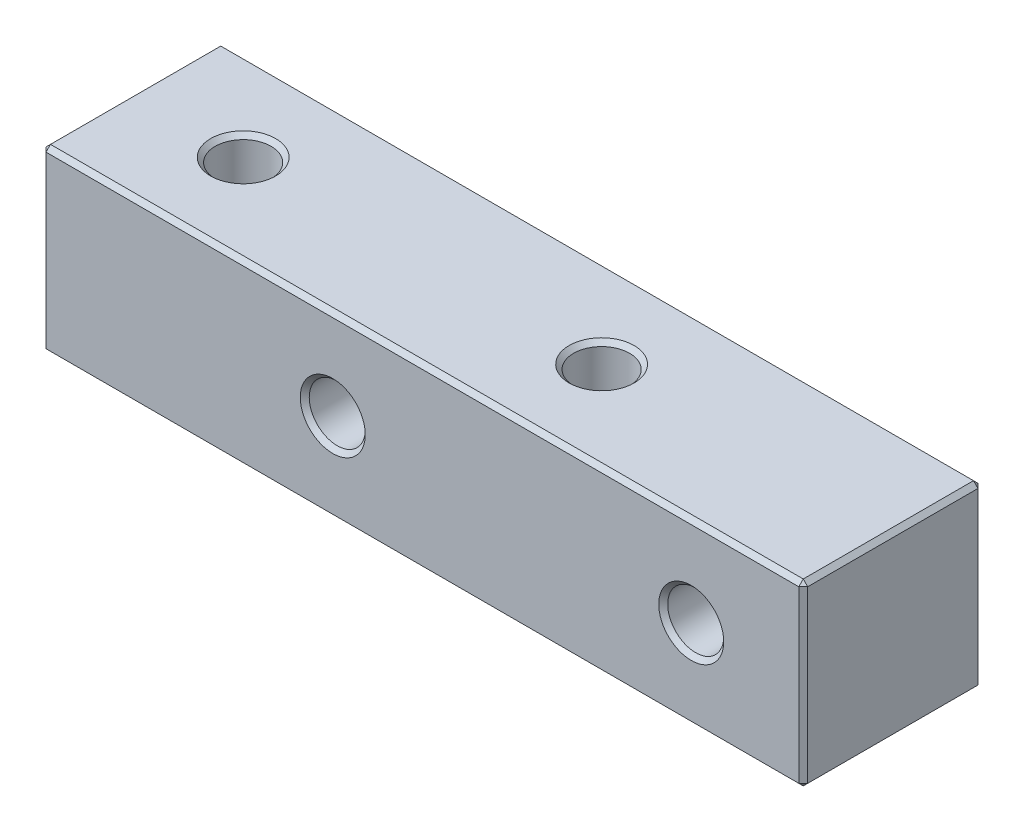
ISO-10303-21;
HEADER;
FILE_DESCRIPTION(('STEP AP214'),'2;1');
FILE_NAME('part.step','',(''),(''),'','','');
FILE_SCHEMA(('AUTOMOTIVE_DESIGN { 1 0 10303 214 1 1 1 1 }'));
ENDSEC;
DATA;
#1=APPLICATION_CONTEXT('core data for automotive mechanical design processes');
#2=APPLICATION_PROTOCOL_DEFINITION('international standard','automotive_design',2000,#1);
#3=PRODUCT_CONTEXT('',#1,'mechanical');
#4=PRODUCT('Part','Part','',(#3));
#5=PRODUCT_RELATED_PRODUCT_CATEGORY('part','',(#4));
#6=PRODUCT_DEFINITION_FORMATION('','',#4);
#7=PRODUCT_DEFINITION_CONTEXT('part definition',#1,'design');
#8=PRODUCT_DEFINITION('design','',#6,#7);
#9=PRODUCT_DEFINITION_SHAPE('','',#8);
#10=(LENGTH_UNIT() NAMED_UNIT(*) SI_UNIT(.MILLI.,.METRE.));
#11=(NAMED_UNIT(*) PLANE_ANGLE_UNIT() SI_UNIT($,.RADIAN.));
#12=(NAMED_UNIT(*) SI_UNIT($,.STERADIAN.) SOLID_ANGLE_UNIT());
#13=UNCERTAINTY_MEASURE_WITH_UNIT(LENGTH_MEASURE(1.E-05),#10,'distance_accuracy_value','');
#14=(GEOMETRIC_REPRESENTATION_CONTEXT(3) GLOBAL_UNCERTAINTY_ASSIGNED_CONTEXT((#13)) GLOBAL_UNIT_ASSIGNED_CONTEXT((#10,
#11,#12)) REPRESENTATION_CONTEXT('',''));
#15=CARTESIAN_POINT('',(0.,0.,0.));
#16=DIRECTION('',(0.,0.,1.));
#17=DIRECTION('',(1.,0.,0.));
#18=AXIS2_PLACEMENT_3D('',#15,#16,#17);
#19=CARTESIAN_POINT('',(17.,4.,-4.));
#20=DIRECTION('',(-1.,0.,0.));
#21=DIRECTION('',(0.,0.,1.));
#22=AXIS2_PLACEMENT_3D('',#19,#20,#21);
#23=PLANE('',#22);
#24=DIRECTION('',(0.,-1.,0.));
#25=VECTOR('',#24,1.);
#26=CARTESIAN_POINT('',(17.,4.,3.8));
#27=LINE('',#26,#25);
#28=CARTESIAN_POINT('',(17.,3.8,3.8));
#29=VERTEX_POINT('',#28);
#30=CARTESIAN_POINT('',(17.,-3.8,3.8));
#31=VERTEX_POINT('',#30);
#32=EDGE_CURVE('E241',#29,#31,#27,.T.);
#33=ORIENTED_EDGE('',*,*,#32,.T.);
#34=DIRECTION('',(0.,0.,-1.));
#35=VECTOR('',#34,1.);
#36=CARTESIAN_POINT('',(17.,-3.8,-4.));
#37=LINE('',#36,#35);
#38=CARTESIAN_POINT('',(17.,-3.8,-3.8));
#39=VERTEX_POINT('',#38);
#40=EDGE_CURVE('E243',#31,#39,#37,.T.);
#41=ORIENTED_EDGE('',*,*,#40,.T.);
#42=DIRECTION('',(0.,1.,0.));
#43=VECTOR('',#42,1.);
#44=CARTESIAN_POINT('',(17.,4.,-3.8));
#45=LINE('',#44,#43);
#46=CARTESIAN_POINT('',(17.,3.8,-3.8));
#47=VERTEX_POINT('',#46);
#48=EDGE_CURVE('E237',#39,#47,#45,.T.);
#49=ORIENTED_EDGE('',*,*,#48,.T.);
#50=DIRECTION('',(0.,0.,1.));
#51=VECTOR('',#50,1.);
#52=CARTESIAN_POINT('',(17.,3.8,4.));
#53=LINE('',#52,#51);
#54=EDGE_CURVE('E239',#47,#29,#53,.T.);
#55=ORIENTED_EDGE('',*,*,#54,.T.);
#56=EDGE_LOOP('',(#33,#41,#49,#55));
#57=FACE_BOUND('',#56,.T.);
#58=ADVANCED_FACE('F41',(#57),#23,.F.);
#59=CARTESIAN_POINT('',(-17.,4.,-4.));
#60=DIRECTION('',(0.,0.,1.));
#61=DIRECTION('',(1.,0.,0.));
#62=AXIS2_PLACEMENT_3D('',#59,#60,#61);
#63=PLANE('',#62);
#64=DIRECTION('',(1.,0.,0.));
#65=VECTOR('',#64,1.);
#66=CARTESIAN_POINT('',(17.,3.8,-4.));
#67=LINE('',#66,#65);
#68=CARTESIAN_POINT('',(-16.8,3.8,-4.));
#69=VERTEX_POINT('',#68);
#70=CARTESIAN_POINT('',(16.8,3.8,-4.));
#71=VERTEX_POINT('',#70);
#72=EDGE_CURVE('E51',#69,#71,#67,.T.);
#73=ORIENTED_EDGE('',*,*,#72,.T.);
#74=DIRECTION('',(0.,-1.,0.));
#75=VECTOR('',#74,1.);
#76=CARTESIAN_POINT('',(16.8,4.,-4.));
#77=LINE('',#76,#75);
#78=CARTESIAN_POINT('',(16.8,-3.8,-4.));
#79=VERTEX_POINT('',#78);
#80=EDGE_CURVE('E11',#71,#79,#77,.T.);
#81=ORIENTED_EDGE('',*,*,#80,.T.);
#82=DIRECTION('',(-1.,0.,0.));
#83=VECTOR('',#82,1.);
#84=CARTESIAN_POINT('',(-17.,-3.8,-4.));
#85=LINE('',#84,#83);
#86=CARTESIAN_POINT('',(-16.8,-3.8,-4.));
#87=VERTEX_POINT('',#86);
#88=EDGE_CURVE('E252',#79,#87,#85,.T.);
#89=ORIENTED_EDGE('',*,*,#88,.T.);
#90=DIRECTION('',(0.,1.,0.));
#91=VECTOR('',#90,1.);
#92=CARTESIAN_POINT('',(-16.8,4.,-4.));
#93=LINE('',#92,#91);
#94=EDGE_CURVE('E62',#87,#69,#93,.T.);
#95=ORIENTED_EDGE('',*,*,#94,.T.);
#96=EDGE_LOOP('',(#73,#81,#89,#95));
#97=FACE_BOUND('',#96,.T.);
#98=CARTESIAN_POINT('',(-4.,0.,-4.));
#99=DIRECTION('',(0.,0.,1.));
#100=DIRECTION('',(1.,0.,0.));
#101=AXIS2_PLACEMENT_3D('',#98,#99,#100);
#102=CIRCLE('',#101,1.44999999999998);
#103=CARTESIAN_POINT('',(-2.55000000000002,0.,-4.));
#104=VERTEX_POINT('',#103);
#105=EDGE_CURVE('E249',#104,#104,#102,.T.);
#106=ORIENTED_EDGE('',*,*,#105,.T.);
#107=EDGE_LOOP('',(#106));
#108=FACE_BOUND('',#107,.T.);
#109=CARTESIAN_POINT('',(12.,0.,-4.));
#110=DIRECTION('',(0.,0.,1.));
#111=DIRECTION('',(1.,0.,0.));
#112=AXIS2_PLACEMENT_3D('',#109,#110,#111);
#113=CIRCLE('',#112,1.44999999999998);
#114=CARTESIAN_POINT('',(13.45,0.,-4.));
#115=VERTEX_POINT('',#114);
#116=EDGE_CURVE('E246',#115,#115,#113,.T.);
#117=ORIENTED_EDGE('',*,*,#116,.T.);
#118=EDGE_LOOP('',(#117));
#119=FACE_BOUND('',#118,.T.);
#120=ADVANCED_FACE('F324',(#97,#108,#119),#63,.F.);
#121=CARTESIAN_POINT('',(-17.,4.,-4.));
#122=DIRECTION('',(1.,0.,0.));
#123=DIRECTION('',(0.,0.,-1.));
#124=AXIS2_PLACEMENT_3D('',#121,#122,#123);
#125=PLANE('',#124);
#126=DIRECTION('',(0.,-1.,0.));
#127=VECTOR('',#126,1.);
#128=CARTESIAN_POINT('',(-17.,4.,-3.8));
#129=LINE('',#128,#127);
#130=CARTESIAN_POINT('',(-17.,3.8,-3.8));
#131=VERTEX_POINT('',#130);
#132=CARTESIAN_POINT('',(-17.,-3.8,-3.8));
#133=VERTEX_POINT('',#132);
#134=EDGE_CURVE('E230',#131,#133,#129,.T.);
#135=ORIENTED_EDGE('',*,*,#134,.T.);
#136=DIRECTION('',(0.,0.,1.));
#137=VECTOR('',#136,1.);
#138=CARTESIAN_POINT('',(-17.,-3.8,-4.));
#139=LINE('',#138,#137);
#140=CARTESIAN_POINT('',(-17.,-3.8,3.8));
#141=VERTEX_POINT('',#140);
#142=EDGE_CURVE('E138',#133,#141,#139,.T.);
#143=ORIENTED_EDGE('',*,*,#142,.T.);
#144=DIRECTION('',(0.,1.,0.));
#145=VECTOR('',#144,1.);
#146=CARTESIAN_POINT('',(-17.,4.,3.8));
#147=LINE('',#146,#145);
#148=CARTESIAN_POINT('',(-17.,3.8,3.8));
#149=VERTEX_POINT('',#148);
#150=EDGE_CURVE('E234',#141,#149,#147,.T.);
#151=ORIENTED_EDGE('',*,*,#150,.T.);
#152=DIRECTION('',(0.,0.,-1.));
#153=VECTOR('',#152,1.);
#154=CARTESIAN_POINT('',(-17.,3.8,-4.));
#155=LINE('',#154,#153);
#156=EDGE_CURVE('E232',#149,#131,#155,.T.);
#157=ORIENTED_EDGE('',*,*,#156,.T.);
#158=EDGE_LOOP('',(#135,#143,#151,#157));
#159=FACE_BOUND('',#158,.T.);
#160=ADVANCED_FACE('F381',(#159),#125,.F.);
#161=CARTESIAN_POINT('',(-17.,4.,4.));
#162=DIRECTION('',(0.,0.,-1.));
#163=DIRECTION('',(-1.,0.,0.));
#164=AXIS2_PLACEMENT_3D('',#161,#162,#163);
#165=PLANE('',#164);
#166=CARTESIAN_POINT('',(-4.,0.,4.));
#167=DIRECTION('',(0.,0.,-1.));
#168=DIRECTION('',(-1.,0.,0.));
#169=AXIS2_PLACEMENT_3D('',#166,#167,#168);
#170=CIRCLE('',#169,1.45);
#171=CARTESIAN_POINT('',(-5.45,0.,4.));
#172=VERTEX_POINT('',#171);
#173=EDGE_CURVE('E200',#172,#172,#170,.T.);
#174=ORIENTED_EDGE('',*,*,#173,.T.);
#175=EDGE_LOOP('',(#174));
#176=FACE_BOUND('',#175,.T.);
#177=CARTESIAN_POINT('',(12.,0.,4.));
#178=DIRECTION('',(0.,0.,-1.));
#179=DIRECTION('',(-1.,0.,0.));
#180=AXIS2_PLACEMENT_3D('',#177,#178,#179);
#181=CIRCLE('',#180,1.45);
#182=CARTESIAN_POINT('',(13.45,0.,4.));
#183=VERTEX_POINT('',#182);
#184=EDGE_CURVE('E197',#183,#183,#181,.T.);
#185=ORIENTED_EDGE('',*,*,#184,.T.);
#186=EDGE_LOOP('',(#185));
#187=FACE_BOUND('',#186,.T.);
#188=DIRECTION('',(-1.,0.,0.));
#189=VECTOR('',#188,1.);
#190=CARTESIAN_POINT('',(-17.,3.8,4.));
#191=LINE('',#190,#189);
#192=CARTESIAN_POINT('',(16.8,3.8,4.));
#193=VERTEX_POINT('',#192);
#194=CARTESIAN_POINT('',(-16.8,3.8,4.));
#195=VERTEX_POINT('',#194);
#196=EDGE_CURVE('E188',#193,#195,#191,.T.);
#197=ORIENTED_EDGE('',*,*,#196,.T.);
#198=DIRECTION('',(0.,-1.,0.));
#199=VECTOR('',#198,1.);
#200=CARTESIAN_POINT('',(-16.8,4.,4.));
#201=LINE('',#200,#199);
#202=CARTESIAN_POINT('',(-16.8,-3.8,4.));
#203=VERTEX_POINT('',#202);
#204=EDGE_CURVE('E194',#195,#203,#201,.T.);
#205=ORIENTED_EDGE('',*,*,#204,.T.);
#206=DIRECTION('',(1.,0.,0.));
#207=VECTOR('',#206,1.);
#208=CARTESIAN_POINT('',(-17.,-3.8,4.));
#209=LINE('',#208,#207);
#210=CARTESIAN_POINT('',(16.8,-3.8,4.));
#211=VERTEX_POINT('',#210);
#212=EDGE_CURVE('E192',#203,#211,#209,.T.);
#213=ORIENTED_EDGE('',*,*,#212,.T.);
#214=DIRECTION('',(0.,1.,0.));
#215=VECTOR('',#214,1.);
#216=CARTESIAN_POINT('',(16.8,4.,4.));
#217=LINE('',#216,#215);
#218=EDGE_CURVE('E190',#211,#193,#217,.T.);
#219=ORIENTED_EDGE('',*,*,#218,.T.);
#220=EDGE_LOOP('',(#197,#205,#213,#219));
#221=FACE_BOUND('',#220,.T.);
#222=ADVANCED_FACE('F556',(#176,#187,#221),#165,.F.);
#223=CARTESIAN_POINT('',(0.,4.,0.));
#224=DIRECTION('',(0.,1.,0.));
#225=DIRECTION('',(0.,0.,1.));
#226=AXIS2_PLACEMENT_3D('',#223,#224,#225);
#227=PLANE('',#226);
#228=CARTESIAN_POINT('',(4.,4.,0.));
#229=DIRECTION('',(0.,1.,0.));
#230=DIRECTION('',(0.,0.,1.));
#231=AXIS2_PLACEMENT_3D('',#228,#229,#230);
#232=CIRCLE('',#231,1.44999999999999);
#233=CARTESIAN_POINT('',(4.,4.,1.44999999999999));
#234=VERTEX_POINT('',#233);
#235=EDGE_CURVE('E227',#234,#234,#232,.F.);
#236=ORIENTED_EDGE('',*,*,#235,.T.);
#237=EDGE_LOOP('',(#236));
#238=FACE_BOUND('',#237,.T.);
#239=CARTESIAN_POINT('',(-12.,4.,0.));
#240=DIRECTION('',(0.,1.,0.));
#241=DIRECTION('',(0.,0.,1.));
#242=AXIS2_PLACEMENT_3D('',#239,#240,#241);
#243=CIRCLE('',#242,1.44999999999998);
#244=CARTESIAN_POINT('',(-12.,4.,1.44999999999998));
#245=VERTEX_POINT('',#244);
#246=EDGE_CURVE('E224',#245,#245,#243,.F.);
#247=ORIENTED_EDGE('',*,*,#246,.T.);
#248=EDGE_LOOP('',(#247));
#249=FACE_BOUND('',#248,.T.);
#250=DIRECTION('',(0.,0.,1.));
#251=VECTOR('',#250,1.);
#252=CARTESIAN_POINT('',(-16.8,4.,4.));
#253=LINE('',#252,#251);
#254=CARTESIAN_POINT('',(-16.8,4.,-3.8));
#255=VERTEX_POINT('',#254);
#256=CARTESIAN_POINT('',(-16.8,4.,3.8));
#257=VERTEX_POINT('',#256);
#258=EDGE_CURVE('E219',#255,#257,#253,.T.);
#259=ORIENTED_EDGE('',*,*,#258,.T.);
#260=DIRECTION('',(1.,0.,0.));
#261=VECTOR('',#260,1.);
#262=CARTESIAN_POINT('',(17.,4.,3.8));
#263=LINE('',#262,#261);
#264=CARTESIAN_POINT('',(16.8,4.,3.8));
#265=VERTEX_POINT('',#264);
#266=EDGE_CURVE('E221',#257,#265,#263,.T.);
#267=ORIENTED_EDGE('',*,*,#266,.T.);
#268=DIRECTION('',(0.,0.,-1.));
#269=VECTOR('',#268,1.);
#270=CARTESIAN_POINT('',(16.8,4.,-4.));
#271=LINE('',#270,#269);
#272=CARTESIAN_POINT('',(16.8,4.,-3.8));
#273=VERTEX_POINT('',#272);
#274=EDGE_CURVE('E217',#265,#273,#271,.T.);
#275=ORIENTED_EDGE('',*,*,#274,.T.);
#276=DIRECTION('',(-1.,0.,0.));
#277=VECTOR('',#276,1.);
#278=CARTESIAN_POINT('',(-17.,4.,-3.8));
#279=LINE('',#278,#277);
#280=EDGE_CURVE('E215',#273,#255,#279,.T.);
#281=ORIENTED_EDGE('',*,*,#280,.T.);
#282=EDGE_LOOP('',(#259,#267,#275,#281));
#283=FACE_BOUND('',#282,.T.);
#284=ADVANCED_FACE('F338',(#238,#249,#283),#227,.T.);
#285=CARTESIAN_POINT('',(0.,-4.,0.));
#286=DIRECTION('',(0.,1.,0.));
#287=DIRECTION('',(0.,0.,1.));
#288=AXIS2_PLACEMENT_3D('',#285,#286,#287);
#289=PLANE('',#288);
#290=CARTESIAN_POINT('',(4.,-4.,0.));
#291=DIRECTION('',(0.,1.,0.));
#292=DIRECTION('',(0.,0.,1.));
#293=AXIS2_PLACEMENT_3D('',#290,#291,#292);
#294=CIRCLE('',#293,1.45);
#295=CARTESIAN_POINT('',(4.,-4.,1.45));
#296=VERTEX_POINT('',#295);
#297=EDGE_CURVE('E173',#296,#296,#294,.T.);
#298=ORIENTED_EDGE('',*,*,#297,.T.);
#299=EDGE_LOOP('',(#298));
#300=FACE_BOUND('',#299,.T.);
#301=CARTESIAN_POINT('',(-12.,-4.,0.));
#302=DIRECTION('',(0.,1.,0.));
#303=DIRECTION('',(0.,0.,1.));
#304=AXIS2_PLACEMENT_3D('',#301,#302,#303);
#305=CIRCLE('',#304,1.45);
#306=CARTESIAN_POINT('',(-12.,-4.,1.45));
#307=VERTEX_POINT('',#306);
#308=EDGE_CURVE('E167',#307,#307,#305,.T.);
#309=ORIENTED_EDGE('',*,*,#308,.T.);
#310=EDGE_LOOP('',(#309));
#311=FACE_BOUND('',#310,.T.);
#312=DIRECTION('',(0.,0.,1.));
#313=VECTOR('',#312,1.);
#314=CARTESIAN_POINT('',(16.8,-4.,0.));
#315=LINE('',#314,#313);
#316=CARTESIAN_POINT('',(16.8,-4.,-3.8));
#317=VERTEX_POINT('',#316);
#318=CARTESIAN_POINT('',(16.8,-4.,3.8));
#319=VERTEX_POINT('',#318);
#320=EDGE_CURVE('E160',#317,#319,#315,.T.);
#321=ORIENTED_EDGE('',*,*,#320,.T.);
#322=DIRECTION('',(-1.,0.,0.));
#323=VECTOR('',#322,1.);
#324=CARTESIAN_POINT('',(0.,-4.,3.8));
#325=LINE('',#324,#323);
#326=CARTESIAN_POINT('',(-16.8,-4.,3.8));
#327=VERTEX_POINT('',#326);
#328=EDGE_CURVE('E164',#319,#327,#325,.T.);
#329=ORIENTED_EDGE('',*,*,#328,.T.);
#330=DIRECTION('',(0.,0.,-1.));
#331=VECTOR('',#330,1.);
#332=CARTESIAN_POINT('',(-16.8,-4.,0.));
#333=LINE('',#332,#331);
#334=CARTESIAN_POINT('',(-16.8,-4.,-3.8));
#335=VERTEX_POINT('',#334);
#336=EDGE_CURVE('E135',#327,#335,#333,.T.);
#337=ORIENTED_EDGE('',*,*,#336,.T.);
#338=DIRECTION('',(1.,0.,0.));
#339=VECTOR('',#338,1.);
#340=CARTESIAN_POINT('',(0.,-4.,-3.8));
#341=LINE('',#340,#339);
#342=EDGE_CURVE('E154',#335,#317,#341,.T.);
#343=ORIENTED_EDGE('',*,*,#342,.T.);
#344=EDGE_LOOP('',(#321,#329,#337,#343));
#345=FACE_BOUND('',#344,.T.);
#346=ADVANCED_FACE('F162',(#300,#311,#345),#289,.F.);
#347=CARTESIAN_POINT('',(4.,4.,0.));
#348=DIRECTION('',(0.,1.,0.));
#349=DIRECTION('',(0.,0.,1.));
#350=AXIS2_PLACEMENT_3D('',#347,#348,#349);
#351=CYLINDRICAL_SURFACE('',#350,1.24999999999999);
#352=CARTESIAN_POINT('',(4.,-3.79999999999999,0.));
#353=DIRECTION('',(0.,1.,0.));
#354=DIRECTION('',(0.,0.,1.));
#355=AXIS2_PLACEMENT_3D('',#352,#353,#354);
#356=CIRCLE('',#355,1.24999999999999);
#357=CARTESIAN_POINT('',(4.,-3.79999999999999,1.24999999999999));
#358=VERTEX_POINT('',#357);
#359=EDGE_CURVE('E179',#358,#358,#356,.F.);
#360=ORIENTED_EDGE('',*,*,#359,.T.);
#361=EDGE_LOOP('',(#360));
#362=FACE_BOUND('',#361,.T.);
#363=CARTESIAN_POINT('',(4.,3.8,0.));
#364=DIRECTION('',(0.,1.,0.));
#365=DIRECTION('',(0.,0.,1.));
#366=AXIS2_PLACEMENT_3D('',#363,#364,#365);
#367=CIRCLE('',#366,1.24999999999999);
#368=CARTESIAN_POINT('',(4.,3.8,1.24999999999999));
#369=VERTEX_POINT('',#368);
#370=EDGE_CURVE('E176',#369,#369,#367,.T.);
#371=ORIENTED_EDGE('',*,*,#370,.T.);
#372=EDGE_LOOP('',(#371));
#373=FACE_BOUND('',#372,.T.);
#374=ADVANCED_FACE('F547',(#362,#373),#351,.F.);
#375=CARTESIAN_POINT('',(-12.,4.,0.));
#376=DIRECTION('',(0.,1.,0.));
#377=DIRECTION('',(0.,0.,1.));
#378=AXIS2_PLACEMENT_3D('',#375,#376,#377);
#379=CYLINDRICAL_SURFACE('',#378,1.24999999999999);
#380=CARTESIAN_POINT('',(-12.,-3.79999999999999,0.));
#381=DIRECTION('',(0.,1.,0.));
#382=DIRECTION('',(0.,0.,1.));
#383=AXIS2_PLACEMENT_3D('',#380,#381,#382);
#384=CIRCLE('',#383,1.24999999999999);
#385=CARTESIAN_POINT('',(-12.,-3.79999999999999,1.24999999999999));
#386=VERTEX_POINT('',#385);
#387=EDGE_CURVE('E185',#386,#386,#384,.F.);
#388=ORIENTED_EDGE('',*,*,#387,.T.);
#389=EDGE_LOOP('',(#388));
#390=FACE_BOUND('',#389,.T.);
#391=CARTESIAN_POINT('',(-12.,3.80000000000001,0.));
#392=DIRECTION('',(0.,1.,0.));
#393=DIRECTION('',(0.,0.,1.));
#394=AXIS2_PLACEMENT_3D('',#391,#392,#393);
#395=CIRCLE('',#394,1.24999999999999);
#396=CARTESIAN_POINT('',(-12.,3.80000000000001,1.24999999999999));
#397=VERTEX_POINT('',#396);
#398=EDGE_CURVE('E182',#397,#397,#395,.T.);
#399=ORIENTED_EDGE('',*,*,#398,.T.);
#400=EDGE_LOOP('',(#399));
#401=FACE_BOUND('',#400,.T.);
#402=ADVANCED_FACE('F538',(#390,#401),#379,.F.);
#403=CARTESIAN_POINT('',(-4.,0.,-4.));
#404=DIRECTION('',(0.,0.,-1.));
#405=DIRECTION('',(-1.,0.,0.));
#406=AXIS2_PLACEMENT_3D('',#403,#404,#405);
#407=CYLINDRICAL_SURFACE('',#406,1.24999999999999);
#408=CARTESIAN_POINT('',(-4.,0.,3.79999999999999));
#409=DIRECTION('',(0.,0.,-1.));
#410=DIRECTION('',(-1.,0.,0.));
#411=AXIS2_PLACEMENT_3D('',#408,#409,#410);
#412=CIRCLE('',#411,1.24999999999999);
#413=CARTESIAN_POINT('',(-5.24999999999999,0.,3.79999999999999));
#414=VERTEX_POINT('',#413);
#415=EDGE_CURVE('E206',#414,#414,#412,.F.);
#416=ORIENTED_EDGE('',*,*,#415,.T.);
#417=EDGE_LOOP('',(#416));
#418=FACE_BOUND('',#417,.T.);
#419=CARTESIAN_POINT('',(-4.,0.,-3.80000000000001));
#420=DIRECTION('',(0.,0.,1.));
#421=DIRECTION('',(1.,0.,0.));
#422=AXIS2_PLACEMENT_3D('',#419,#420,#421);
#423=CIRCLE('',#422,1.24999999999999);
#424=CARTESIAN_POINT('',(-2.75000000000001,0.,-3.80000000000001));
#425=VERTEX_POINT('',#424);
#426=EDGE_CURVE('E203',#425,#425,#423,.F.);
#427=ORIENTED_EDGE('',*,*,#426,.T.);
#428=EDGE_LOOP('',(#427));
#429=FACE_BOUND('',#428,.T.);
#430=ADVANCED_FACE('F536',(#418,#429),#407,.F.);
#431=CARTESIAN_POINT('',(12.,0.,-4.));
#432=DIRECTION('',(0.,0.,-1.));
#433=DIRECTION('',(-1.,0.,0.));
#434=AXIS2_PLACEMENT_3D('',#431,#432,#433);
#435=CYLINDRICAL_SURFACE('',#434,1.24999999999999);
#436=CARTESIAN_POINT('',(12.,0.,3.8));
#437=DIRECTION('',(0.,0.,-1.));
#438=DIRECTION('',(-1.,0.,0.));
#439=AXIS2_PLACEMENT_3D('',#436,#437,#438);
#440=CIRCLE('',#439,1.24999999999999);
#441=CARTESIAN_POINT('',(13.25,0.,3.8));
#442=VERTEX_POINT('',#441);
#443=EDGE_CURVE('E212',#442,#442,#440,.F.);
#444=ORIENTED_EDGE('',*,*,#443,.T.);
#445=EDGE_LOOP('',(#444));
#446=FACE_BOUND('',#445,.T.);
#447=CARTESIAN_POINT('',(12.,0.,-3.80000000000001));
#448=DIRECTION('',(0.,0.,1.));
#449=DIRECTION('',(1.,0.,0.));
#450=AXIS2_PLACEMENT_3D('',#447,#448,#449);
#451=CIRCLE('',#450,1.24999999999999);
#452=CARTESIAN_POINT('',(13.25,0.,-3.80000000000001));
#453=VERTEX_POINT('',#452);
#454=EDGE_CURVE('E209',#453,#453,#451,.F.);
#455=ORIENTED_EDGE('',*,*,#454,.T.);
#456=EDGE_LOOP('',(#455));
#457=FACE_BOUND('',#456,.T.);
#458=ADVANCED_FACE('F393',(#446,#457),#435,.F.);
#459=CARTESIAN_POINT('',(4.,-4.,0.));
#460=DIRECTION('',(0.,-1.,0.));
#461=DIRECTION('',(0.,0.,-1.));
#462=AXIS2_PLACEMENT_3D('',#459,#460,#461);
#463=CONICAL_SURFACE('',#462,1.45,0.78539816339744);
#464=ORIENTED_EDGE('',*,*,#359,.F.);
#465=EDGE_LOOP('',(#464));
#466=FACE_BOUND('',#465,.T.);
#467=ORIENTED_EDGE('',*,*,#297,.F.);
#468=EDGE_LOOP('',(#467));
#469=FACE_BOUND('',#468,.T.);
#470=ADVANCED_FACE('F386',(#466,#469),#463,.F.);
#471=CARTESIAN_POINT('',(-12.,-4.,0.));
#472=DIRECTION('',(0.,-1.,0.));
#473=DIRECTION('',(0.,0.,-1.));
#474=AXIS2_PLACEMENT_3D('',#471,#472,#473);
#475=CONICAL_SURFACE('',#474,1.45,0.78539816339744);
#476=ORIENTED_EDGE('',*,*,#387,.F.);
#477=EDGE_LOOP('',(#476));
#478=FACE_BOUND('',#477,.T.);
#479=ORIENTED_EDGE('',*,*,#308,.F.);
#480=EDGE_LOOP('',(#479));
#481=FACE_BOUND('',#480,.T.);
#482=ADVANCED_FACE('F392',(#478,#481),#475,.F.);
#483=CARTESIAN_POINT('',(-4.,0.,4.));
#484=DIRECTION('',(0.,0.,1.));
#485=DIRECTION('',(1.,0.,0.));
#486=AXIS2_PLACEMENT_3D('',#483,#484,#485);
#487=CONICAL_SURFACE('',#486,1.45,0.78539816339744);
#488=ORIENTED_EDGE('',*,*,#415,.F.);
#489=EDGE_LOOP('',(#488));
#490=FACE_BOUND('',#489,.T.);
#491=ORIENTED_EDGE('',*,*,#173,.F.);
#492=EDGE_LOOP('',(#491));
#493=FACE_BOUND('',#492,.T.);
#494=ADVANCED_FACE('F400',(#490,#493),#487,.F.);
#495=CARTESIAN_POINT('',(12.,0.,4.));
#496=DIRECTION('',(0.,0.,1.));
#497=DIRECTION('',(1.,0.,0.));
#498=AXIS2_PLACEMENT_3D('',#495,#496,#497);
#499=CONICAL_SURFACE('',#498,1.45,0.785398163397455);
#500=CARTESIAN_POINT('',(13.25,0.,3.8));
#501=CARTESIAN_POINT('',(13.2520833333333,0.,3.80208333333333));
#502=CARTESIAN_POINT('',(13.2541666666667,0.,3.80416666666666));
#503=CARTESIAN_POINT('',(13.2583333333333,0.,3.80833333333333));
#504=CARTESIAN_POINT('',(13.2604166666667,0.,3.81041666666666));
#505=CARTESIAN_POINT('',(13.2645833333333,0.,3.81458333333333));
#506=CARTESIAN_POINT('',(13.2666666666667,0.,3.81666666666666));
#507=CARTESIAN_POINT('',(13.2708333333333,0.,3.82083333333333));
#508=CARTESIAN_POINT('',(13.2729166666667,0.,3.82291666666666));
#509=CARTESIAN_POINT('',(13.2770833333333,0.,3.82708333333333));
#510=CARTESIAN_POINT('',(13.2791666666667,0.,3.82916666666666));
#511=CARTESIAN_POINT('',(13.2833333333333,0.,3.83333333333333));
#512=CARTESIAN_POINT('',(13.2854166666667,0.,3.83541666666666));
#513=CARTESIAN_POINT('',(13.2895833333333,0.,3.83958333333333));
#514=CARTESIAN_POINT('',(13.2916666666667,0.,3.84166666666666));
#515=CARTESIAN_POINT('',(13.2958333333333,0.,3.84583333333333));
#516=CARTESIAN_POINT('',(13.2979166666667,0.,3.84791666666666));
#517=CARTESIAN_POINT('',(13.3020833333333,0.,3.85208333333333));
#518=CARTESIAN_POINT('',(13.3041666666667,0.,3.85416666666666));
#519=CARTESIAN_POINT('',(13.3083333333333,0.,3.85833333333333));
#520=CARTESIAN_POINT('',(13.3104166666667,0.,3.86041666666666));
#521=CARTESIAN_POINT('',(13.3145833333333,0.,3.86458333333333));
#522=CARTESIAN_POINT('',(13.3166666666667,0.,3.86666666666666));
#523=CARTESIAN_POINT('',(13.3208333333333,0.,3.87083333333333));
#524=CARTESIAN_POINT('',(13.3229166666667,0.,3.87291666666666));
#525=CARTESIAN_POINT('',(13.3270833333333,0.,3.87708333333333));
#526=CARTESIAN_POINT('',(13.3291666666667,0.,3.87916666666666));
#527=CARTESIAN_POINT('',(13.3333333333333,0.,3.88333333333333));
#528=CARTESIAN_POINT('',(13.3354166666667,0.,3.88541666666666));
#529=CARTESIAN_POINT('',(13.3395833333333,0.,3.88958333333333));
#530=CARTESIAN_POINT('',(13.3416666666667,0.,3.89166666666666));
#531=CARTESIAN_POINT('',(13.3458333333333,0.,3.89583333333333));
#532=CARTESIAN_POINT('',(13.3479166666667,0.,3.89791666666666));
#533=CARTESIAN_POINT('',(13.3520833333333,0.,3.90208333333333));
#534=CARTESIAN_POINT('',(13.3541666666667,0.,3.90416666666667));
#535=CARTESIAN_POINT('',(13.3583333333333,0.,3.90833333333333));
#536=CARTESIAN_POINT('',(13.3604166666667,0.,3.91041666666666));
#537=CARTESIAN_POINT('',(13.3645833333333,0.,3.91458333333333));
#538=CARTESIAN_POINT('',(13.3666666666667,0.,3.91666666666667));
#539=CARTESIAN_POINT('',(13.3708333333333,0.,3.92083333333333));
#540=CARTESIAN_POINT('',(13.3729166666667,0.,3.92291666666666));
#541=CARTESIAN_POINT('',(13.3770833333333,0.,3.92708333333333));
#542=CARTESIAN_POINT('',(13.3791666666667,0.,3.92916666666667));
#543=CARTESIAN_POINT('',(13.3833333333333,0.,3.93333333333333));
#544=CARTESIAN_POINT('',(13.3854166666667,0.,3.93541666666667));
#545=CARTESIAN_POINT('',(13.3895833333333,0.,3.93958333333333));
#546=CARTESIAN_POINT('',(13.3916666666667,0.,3.94166666666667));
#547=CARTESIAN_POINT('',(13.3958333333333,0.,3.94583333333333));
#548=CARTESIAN_POINT('',(13.3979166666667,0.,3.94791666666667));
#549=CARTESIAN_POINT('',(13.4020833333333,0.,3.95208333333333));
#550=CARTESIAN_POINT('',(13.4041666666667,0.,3.95416666666667));
#551=CARTESIAN_POINT('',(13.4083333333333,0.,3.95833333333333));
#552=CARTESIAN_POINT('',(13.4104166666667,0.,3.96041666666667));
#553=CARTESIAN_POINT('',(13.4145833333333,0.,3.96458333333333));
#554=CARTESIAN_POINT('',(13.4166666666667,0.,3.96666666666667));
#555=CARTESIAN_POINT('',(13.4208333333333,0.,3.97083333333333));
#556=CARTESIAN_POINT('',(13.4229166666667,0.,3.97291666666667));
#557=CARTESIAN_POINT('',(13.4270833333333,0.,3.97708333333333));
#558=CARTESIAN_POINT('',(13.4291666666667,0.,3.97916666666667));
#559=CARTESIAN_POINT('',(13.4333333333333,0.,3.98333333333333));
#560=CARTESIAN_POINT('',(13.4354166666667,0.,3.98541666666667));
#561=CARTESIAN_POINT('',(13.4395833333333,0.,3.98958333333333));
#562=CARTESIAN_POINT('',(13.4416666666667,0.,3.99166666666667));
#563=CARTESIAN_POINT('',(13.4458333333333,0.,3.99583333333333));
#564=CARTESIAN_POINT('',(13.4479166666667,0.,3.99791666666667));
#565=CARTESIAN_POINT('',(13.45,0.,4.));
#566=B_SPLINE_CURVE_WITH_KNOTS('',3,(#500,#501,#502,#503,#504,#505,#506,#507,#508,#509,#510,
#511,#512,#513,#514,#515,#516,#517,#518,#519,#520,#521,#522,#523,#524,#525,#526,#527,#528,#529,
#530,#531,#532,#533,#534,#535,#536,#537,#538,#539,#540,#541,#542,#543,#544,#545,#546,#547,#548,
#549,#550,#551,#552,#553,#554,#555,#556,#557,#558,#559,#560,#561,#562,#563,#564,#565),
.UNSPECIFIED.,.F.,.F.,(4,2,2,2,2,2,2,2,2,2,2,2,2,2,2,2,2,2,2,2,2,2,2,2,2,2,2,2,2,2,2,2,4),(0.,
0.0088388347648324,0.0176776695296639,0.0265165042944966,0.0353553390593281,0.0441941738241608,
0.0530330085889923,0.061871843353825,0.0707106781186565,0.0795495128834892,0.0883883476483207,
0.0972271824131534,0.106066017177986,0.114904851942818,0.12374368670765,0.132582521472482,
0.141421356237314,0.150260191002146,0.159099025766979,0.16793786053181,0.176776695296643,
0.185615530061474,0.194454364826307,0.203293199591139,0.212132034355971,0.220970869120803,
0.229809703885635,0.238648538650468,0.2474873734153,0.256326208180132,0.265165042944964,
0.274003877709797,0.282842712474628),.UNSPECIFIED.);
#567=EDGE_CURVE('BSEAM407',#442,#183,#566,.T.);
#568=ORIENTED_EDGE('',*,*,#443,.F.);
#569=ORIENTED_EDGE('',*,*,#184,.F.);
#570=ORIENTED_EDGE('',*,*,#567,.T.);
#571=ORIENTED_EDGE('',*,*,#567,.F.);
#572=EDGE_LOOP('',(#568,#570,#569,#571));
#573=FACE_BOUND('',#572,.T.);
#574=ADVANCED_FACE('F407',(#573),#499,.F.);
#575=CARTESIAN_POINT('',(4.,3.8,0.));
#576=DIRECTION('',(0.,1.,0.));
#577=DIRECTION('',(0.,0.,1.));
#578=AXIS2_PLACEMENT_3D('',#575,#576,#577);
#579=CONICAL_SURFACE('',#578,1.24999999999999,0.785398163397448);
#580=ORIENTED_EDGE('',*,*,#235,.F.);
#581=EDGE_LOOP('',(#580));
#582=FACE_BOUND('',#581,.T.);
#583=ORIENTED_EDGE('',*,*,#370,.F.);
#584=EDGE_LOOP('',(#583));
#585=FACE_BOUND('',#584,.T.);
#586=ADVANCED_FACE('F414',(#582,#585),#579,.F.);
#587=CARTESIAN_POINT('',(-12.,3.80000000000001,0.));
#588=DIRECTION('',(0.,1.,0.));
#589=DIRECTION('',(0.,0.,1.));
#590=AXIS2_PLACEMENT_3D('',#587,#588,#589);
#591=CONICAL_SURFACE('',#590,1.24999999999999,0.785398163397448);
#592=ORIENTED_EDGE('',*,*,#246,.F.);
#593=EDGE_LOOP('',(#592));
#594=FACE_BOUND('',#593,.T.);
#595=ORIENTED_EDGE('',*,*,#398,.F.);
#596=EDGE_LOOP('',(#595));
#597=FACE_BOUND('',#596,.T.);
#598=ADVANCED_FACE('F421',(#594,#597),#591,.F.);
#599=CARTESIAN_POINT('',(16.8,4.,0.));
#600=DIRECTION('',(0.707106781186554,0.707106781186541,0.));
#601=DIRECTION('',(0.,0.,1.));
#602=AXIS2_PLACEMENT_3D('',#599,#600,#601);
#603=PLANE('',#602);
#604=DIRECTION('',(0.707106781186541,-0.707106781186554,0.));
#605=VECTOR('',#604,1.);
#606=CARTESIAN_POINT('',(16.8,4.,-3.8));
#607=LINE('',#606,#605);
#608=EDGE_CURVE('E46',#273,#47,#607,.T.);
#609=ORIENTED_EDGE('',*,*,#608,.F.);
#610=ORIENTED_EDGE('',*,*,#274,.F.);
#611=DIRECTION('',(-0.707106781186541,0.707106781186554,0.));
#612=VECTOR('',#611,1.);
#613=CARTESIAN_POINT('',(16.9,3.9,3.8));
#614=LINE('',#613,#612);
#615=EDGE_CURVE('E303',#29,#265,#614,.T.);
#616=ORIENTED_EDGE('',*,*,#615,.F.);
#617=ORIENTED_EDGE('',*,*,#54,.F.);
#618=EDGE_LOOP('',(#609,#610,#616,#617));
#619=FACE_BOUND('',#618,.T.);
#620=ADVANCED_FACE('F428',(#619),#603,.T.);
#621=CARTESIAN_POINT('',(16.8,4.,-3.8));
#622=DIRECTION('',(0.577350269189639,0.577350269189629,-0.577350269189609));
#623=DIRECTION('',(-0.707106781186541,0.707106781186554,0.));
#624=AXIS2_PLACEMENT_3D('',#621,#622,#623);
#625=PLANE('',#624);
#626=DIRECTION('',(0.,0.707106781186541,0.707106781186554));
#627=VECTOR('',#626,1.);
#628=CARTESIAN_POINT('',(16.8,4.,-3.8));
#629=LINE('',#628,#627);
#630=EDGE_CURVE('E299',#273,#71,#629,.F.);
#631=ORIENTED_EDGE('',*,*,#630,.F.);
#632=ORIENTED_EDGE('',*,*,#608,.T.);
#633=DIRECTION('',(0.707106781186535,0.,0.70710678118656));
#634=VECTOR('',#633,1.);
#635=CARTESIAN_POINT('',(16.9,3.8,-3.9));
#636=LINE('',#635,#634);
#637=EDGE_CURVE('E301',#71,#47,#636,.T.);
#638=ORIENTED_EDGE('',*,*,#637,.F.);
#639=EDGE_LOOP('',(#631,#632,#638));
#640=FACE_BOUND('',#639,.T.);
#641=ADVANCED_FACE('F315',(#640),#625,.T.);
#642=CARTESIAN_POINT('',(16.8,3.8,4.));
#643=DIRECTION('',(0.577350269189626,0.577350269189616,0.577350269189636));
#644=DIRECTION('',(0.707106781186554,0.,-0.707106781186541));
#645=AXIS2_PLACEMENT_3D('',#642,#643,#644);
#646=PLANE('',#645);
#647=DIRECTION('',(-0.707106781186554,0.,0.707106781186541));
#648=VECTOR('',#647,1.);
#649=CARTESIAN_POINT('',(16.8,3.8,4.));
#650=LINE('',#649,#648);
#651=EDGE_CURVE('E294',#29,#193,#650,.T.);
#652=ORIENTED_EDGE('',*,*,#651,.F.);
#653=ORIENTED_EDGE('',*,*,#615,.T.);
#654=DIRECTION('',(0.,-0.707106781186554,0.707106781186541));
#655=VECTOR('',#654,1.);
#656=CARTESIAN_POINT('',(16.8,3.8,4.));
#657=LINE('',#656,#655);
#658=EDGE_CURVE('E297',#193,#265,#657,.F.);
#659=ORIENTED_EDGE('',*,*,#658,.F.);
#660=EDGE_LOOP('',(#652,#653,#659));
#661=FACE_BOUND('',#660,.T.);
#662=ADVANCED_FACE('F352',(#661),#646,.T.);
#663=CARTESIAN_POINT('',(16.8,4.,-4.));
#664=DIRECTION('',(-0.70710678118656,0.,0.707106781186535));
#665=DIRECTION('',(0.,-1.,0.));
#666=AXIS2_PLACEMENT_3D('',#663,#664,#665);
#667=PLANE('',#666);
#668=ORIENTED_EDGE('',*,*,#637,.T.);
#669=ORIENTED_EDGE('',*,*,#48,.F.);
#670=DIRECTION('',(-0.707106781186535,0.,-0.70710678118656));
#671=VECTOR('',#670,1.);
#672=CARTESIAN_POINT('',(17.,-3.8,-3.8));
#673=LINE('',#672,#671);
#674=EDGE_CURVE('E289',#79,#39,#673,.F.);
#675=ORIENTED_EDGE('',*,*,#674,.F.);
#676=ORIENTED_EDGE('',*,*,#80,.F.);
#677=EDGE_LOOP('',(#668,#669,#675,#676));
#678=FACE_BOUND('',#677,.T.);
#679=ADVANCED_FACE('F322',(#678),#667,.F.);
#680=CARTESIAN_POINT('',(0.,4.,-3.8));
#681=DIRECTION('',(0.,0.707106781186554,-0.707106781186541));
#682=DIRECTION('',(1.,0.,0.));
#683=AXIS2_PLACEMENT_3D('',#680,#681,#682);
#684=PLANE('',#683);
#685=ORIENTED_EDGE('',*,*,#630,.T.);
#686=ORIENTED_EDGE('',*,*,#72,.F.);
#687=DIRECTION('',(0.,-0.707106781186541,-0.707106781186554));
#688=VECTOR('',#687,1.);
#689=CARTESIAN_POINT('',(-16.8,3.9,-3.9));
#690=LINE('',#689,#688);
#691=EDGE_CURVE('E286',#255,#69,#690,.T.);
#692=ORIENTED_EDGE('',*,*,#691,.F.);
#693=ORIENTED_EDGE('',*,*,#280,.F.);
#694=EDGE_LOOP('',(#685,#686,#692,#693));
#695=FACE_BOUND('',#694,.T.);
#696=ADVANCED_FACE('F335',(#695),#684,.T.);
#697=CARTESIAN_POINT('',(-16.8,4.,0.));
#698=DIRECTION('',(-0.707106781186554,0.707106781186541,0.));
#699=DIRECTION('',(0.,0.,-1.));
#700=AXIS2_PLACEMENT_3D('',#697,#698,#699);
#701=PLANE('',#700);
#702=DIRECTION('',(-0.707106781186541,-0.707106781186554,0.));
#703=VECTOR('',#702,1.);
#704=CARTESIAN_POINT('',(-17.,3.8,3.8));
#705=LINE('',#704,#703);
#706=EDGE_CURVE('E280',#257,#149,#705,.T.);
#707=ORIENTED_EDGE('',*,*,#706,.F.);
#708=ORIENTED_EDGE('',*,*,#258,.F.);
#709=DIRECTION('',(0.707106781186541,0.707106781186554,0.));
#710=VECTOR('',#709,1.);
#711=CARTESIAN_POINT('',(-17.,3.8,-3.8));
#712=LINE('',#711,#710);
#713=EDGE_CURVE('E283',#131,#255,#712,.T.);
#714=ORIENTED_EDGE('',*,*,#713,.F.);
#715=ORIENTED_EDGE('',*,*,#156,.F.);
#716=EDGE_LOOP('',(#707,#708,#714,#715));
#717=FACE_BOUND('',#716,.T.);
#718=ADVANCED_FACE('F342',(#717),#701,.T.);
#719=CARTESIAN_POINT('',(0.,4.,3.8));
#720=DIRECTION('',(0.,0.707106781186541,0.707106781186554));
#721=DIRECTION('',(-1.,0.,0.));
#722=AXIS2_PLACEMENT_3D('',#719,#720,#721);
#723=PLANE('',#722);
#724=ORIENTED_EDGE('',*,*,#658,.T.);
#725=ORIENTED_EDGE('',*,*,#266,.F.);
#726=DIRECTION('',(0.,0.707106781186554,-0.707106781186541));
#727=VECTOR('',#726,1.);
#728=CARTESIAN_POINT('',(-16.8,3.9,3.9));
#729=LINE('',#728,#727);
#730=EDGE_CURVE('E277',#195,#257,#729,.T.);
#731=ORIENTED_EDGE('',*,*,#730,.F.);
#732=ORIENTED_EDGE('',*,*,#196,.F.);
#733=EDGE_LOOP('',(#724,#725,#731,#732));
#734=FACE_BOUND('',#733,.T.);
#735=ADVANCED_FACE('F351',(#734),#723,.T.);
#736=CARTESIAN_POINT('',(17.,4.,3.8));
#737=DIRECTION('',(-0.707106781186541,0.,-0.707106781186554));
#738=DIRECTION('',(0.,-1.,0.));
#739=AXIS2_PLACEMENT_3D('',#736,#737,#738);
#740=PLANE('',#739);
#741=ORIENTED_EDGE('',*,*,#651,.T.);
#742=ORIENTED_EDGE('',*,*,#218,.F.);
#743=DIRECTION('',(0.707106781186554,0.,-0.707106781186541));
#744=VECTOR('',#743,1.);
#745=CARTESIAN_POINT('',(16.9,-3.8,3.9));
#746=LINE('',#745,#744);
#747=EDGE_CURVE('E274',#31,#211,#746,.F.);
#748=ORIENTED_EDGE('',*,*,#747,.F.);
#749=ORIENTED_EDGE('',*,*,#32,.F.);
#750=EDGE_LOOP('',(#741,#742,#748,#749));
#751=FACE_BOUND('',#750,.T.);
#752=ADVANCED_FACE('F357',(#751),#740,.F.);
#753=CARTESIAN_POINT('',(17.,-3.8,-4.));
#754=DIRECTION('',(-0.707106781186541,0.707106781186554,0.));
#755=DIRECTION('',(0.,0.,-1.));
#756=AXIS2_PLACEMENT_3D('',#753,#754,#755);
#757=PLANE('',#756);
#758=DIRECTION('',(0.707106781186554,0.707106781186541,0.));
#759=VECTOR('',#758,1.);
#760=CARTESIAN_POINT('',(17.,-3.8,-3.8));
#761=LINE('',#760,#759);
#762=EDGE_CURVE('E291',#39,#317,#761,.F.);
#763=ORIENTED_EDGE('',*,*,#762,.F.);
#764=ORIENTED_EDGE('',*,*,#40,.F.);
#765=DIRECTION('',(-0.707106781186554,-0.707106781186541,0.));
#766=VECTOR('',#765,1.);
#767=CARTESIAN_POINT('',(16.8,-4.,3.8));
#768=LINE('',#767,#766);
#769=EDGE_CURVE('E271',#319,#31,#768,.F.);
#770=ORIENTED_EDGE('',*,*,#769,.F.);
#771=ORIENTED_EDGE('',*,*,#320,.F.);
#772=EDGE_LOOP('',(#763,#764,#770,#771));
#773=FACE_BOUND('',#772,.T.);
#774=ADVANCED_FACE('F363',(#773),#757,.F.);
#775=CARTESIAN_POINT('',(17.,-3.8,-3.8));
#776=DIRECTION('',(0.577350269189629,-0.577350269189639,-0.577350269189609));
#777=DIRECTION('',(0.707106781186554,0.707106781186541,0.));
#778=AXIS2_PLACEMENT_3D('',#775,#776,#777);
#779=PLANE('',#778);
#780=ORIENTED_EDGE('',*,*,#674,.T.);
#781=ORIENTED_EDGE('',*,*,#762,.T.);
#782=DIRECTION('',(0.,-0.707106781186541,0.707106781186554));
#783=VECTOR('',#782,1.);
#784=CARTESIAN_POINT('',(16.8,-3.9,-3.9));
#785=LINE('',#784,#783);
#786=EDGE_CURVE('E157',#79,#317,#785,.T.);
#787=ORIENTED_EDGE('',*,*,#786,.F.);
#788=EDGE_LOOP('',(#780,#781,#787));
#789=FACE_BOUND('',#788,.T.);
#790=ADVANCED_FACE('F366',(#789),#779,.T.);
#791=CARTESIAN_POINT('',(-17.,3.8,-3.8));
#792=DIRECTION('',(-0.577350269189636,0.577350269189626,-0.577350269189616));
#793=DIRECTION('',(-0.707106781186541,-0.707106781186554,0.));
#794=AXIS2_PLACEMENT_3D('',#791,#792,#793);
#795=PLANE('',#794);
#796=ORIENTED_EDGE('',*,*,#713,.T.);
#797=ORIENTED_EDGE('',*,*,#691,.T.);
#798=DIRECTION('',(0.707106781186541,0.,-0.707106781186554));
#799=VECTOR('',#798,1.);
#800=CARTESIAN_POINT('',(-17.,3.8,-3.8));
#801=LINE('',#800,#799);
#802=EDGE_CURVE('E267',#131,#69,#801,.T.);
#803=ORIENTED_EDGE('',*,*,#802,.F.);
#804=EDGE_LOOP('',(#796,#797,#803));
#805=FACE_BOUND('',#804,.T.);
#806=ADVANCED_FACE('F331',(#805),#795,.T.);
#807=CARTESIAN_POINT('',(-17.,3.8,3.8));
#808=DIRECTION('',(-0.577350269189636,0.577350269189616,0.577350269189626));
#809=DIRECTION('',(0.707106781186541,0.,0.707106781186554));
#810=AXIS2_PLACEMENT_3D('',#807,#808,#809);
#811=PLANE('',#810);
#812=ORIENTED_EDGE('',*,*,#730,.T.);
#813=ORIENTED_EDGE('',*,*,#706,.T.);
#814=DIRECTION('',(-0.707106781186541,0.,-0.707106781186554));
#815=VECTOR('',#814,1.);
#816=CARTESIAN_POINT('',(-17.,3.8,3.8));
#817=LINE('',#816,#815);
#818=EDGE_CURVE('E264',#195,#149,#817,.T.);
#819=ORIENTED_EDGE('',*,*,#818,.F.);
#820=EDGE_LOOP('',(#812,#813,#819));
#821=FACE_BOUND('',#820,.T.);
#822=ADVANCED_FACE('F347',(#821),#811,.T.);
#823=CARTESIAN_POINT('',(16.8,-4.,3.8));
#824=DIRECTION('',(0.577350269189616,-0.577350269189636,0.577350269189626));
#825=DIRECTION('',(0.,-0.707106781186541,-0.707106781186554));
#826=AXIS2_PLACEMENT_3D('',#823,#824,#825);
#827=PLANE('',#826);
#828=ORIENTED_EDGE('',*,*,#769,.T.);
#829=ORIENTED_EDGE('',*,*,#747,.T.);
#830=DIRECTION('',(0.,0.707106781186541,0.707106781186554));
#831=VECTOR('',#830,1.);
#832=CARTESIAN_POINT('',(16.8,-4.,3.8));
#833=LINE('',#832,#831);
#834=EDGE_CURVE('E151',#319,#211,#833,.T.);
#835=ORIENTED_EDGE('',*,*,#834,.F.);
#836=EDGE_LOOP('',(#828,#829,#835));
#837=FACE_BOUND('',#836,.T.);
#838=ADVANCED_FACE('F474',(#837),#827,.T.);
#839=CARTESIAN_POINT('',(-17.,-3.8,-4.));
#840=DIRECTION('',(0.,0.707106781186554,0.707106781186541));
#841=DIRECTION('',(-1.,0.,0.));
#842=AXIS2_PLACEMENT_3D('',#839,#840,#841);
#843=PLANE('',#842);
#844=ORIENTED_EDGE('',*,*,#786,.T.);
#845=ORIENTED_EDGE('',*,*,#342,.F.);
#846=DIRECTION('',(0.,0.707106781186541,-0.707106781186554));
#847=VECTOR('',#846,1.);
#848=CARTESIAN_POINT('',(-16.8,-4.,-3.8));
#849=LINE('',#848,#847);
#850=EDGE_CURVE('E145',#87,#335,#849,.F.);
#851=ORIENTED_EDGE('',*,*,#850,.F.);
#852=ORIENTED_EDGE('',*,*,#88,.F.);
#853=EDGE_LOOP('',(#844,#845,#851,#852));
#854=FACE_BOUND('',#853,.T.);
#855=ADVANCED_FACE('F155',(#854),#843,.F.);
#856=CARTESIAN_POINT('',(-17.,4.,-3.8));
#857=DIRECTION('',(0.707106781186554,0.,0.707106781186541));
#858=DIRECTION('',(0.,-1.,0.));
#859=AXIS2_PLACEMENT_3D('',#856,#857,#858);
#860=PLANE('',#859);
#861=ORIENTED_EDGE('',*,*,#802,.T.);
#862=ORIENTED_EDGE('',*,*,#94,.F.);
#863=DIRECTION('',(-0.707106781186541,0.,0.707106781186554));
#864=VECTOR('',#863,1.);
#865=CARTESIAN_POINT('',(-16.9,-3.8,-3.9));
#866=LINE('',#865,#864);
#867=EDGE_CURVE('E149',#133,#87,#866,.F.);
#868=ORIENTED_EDGE('',*,*,#867,.F.);
#869=ORIENTED_EDGE('',*,*,#134,.F.);
#870=EDGE_LOOP('',(#861,#862,#868,#869));
#871=FACE_BOUND('',#870,.T.);
#872=ADVANCED_FACE('F327',(#871),#860,.F.);
#873=CARTESIAN_POINT('',(-16.8,4.,4.));
#874=DIRECTION('',(0.707106781186554,0.,-0.707106781186541));
#875=DIRECTION('',(0.,-1.,0.));
#876=AXIS2_PLACEMENT_3D('',#873,#874,#875);
#877=PLANE('',#876);
#878=ORIENTED_EDGE('',*,*,#818,.T.);
#879=ORIENTED_EDGE('',*,*,#150,.F.);
#880=DIRECTION('',(0.707106781186541,0.,0.707106781186554));
#881=VECTOR('',#880,1.);
#882=CARTESIAN_POINT('',(-17.,-3.8,3.8));
#883=LINE('',#882,#881);
#884=EDGE_CURVE('E258',#203,#141,#883,.F.);
#885=ORIENTED_EDGE('',*,*,#884,.F.);
#886=ORIENTED_EDGE('',*,*,#204,.F.);
#887=EDGE_LOOP('',(#878,#879,#885,#886));
#888=FACE_BOUND('',#887,.T.);
#889=ADVANCED_FACE('F456',(#888),#877,.F.);
#890=CARTESIAN_POINT('',(-17.,-3.8,4.));
#891=DIRECTION('',(0.,0.707106781186554,-0.707106781186541));
#892=DIRECTION('',(1.,0.,0.));
#893=AXIS2_PLACEMENT_3D('',#890,#891,#892);
#894=PLANE('',#893);
#895=ORIENTED_EDGE('',*,*,#834,.T.);
#896=ORIENTED_EDGE('',*,*,#212,.F.);
#897=DIRECTION('',(0.,-0.707106781186541,-0.707106781186554));
#898=VECTOR('',#897,1.);
#899=CARTESIAN_POINT('',(-16.8,-3.9,3.9));
#900=LINE('',#899,#898);
#901=EDGE_CURVE('E141',#327,#203,#900,.F.);
#902=ORIENTED_EDGE('',*,*,#901,.F.);
#903=ORIENTED_EDGE('',*,*,#328,.F.);
#904=EDGE_LOOP('',(#895,#896,#902,#903));
#905=FACE_BOUND('',#904,.T.);
#906=ADVANCED_FACE('F450',(#905),#894,.F.);
#907=CARTESIAN_POINT('',(-16.8,-4.,-3.8));
#908=DIRECTION('',(-0.577350269189626,-0.577350269189636,-0.577350269189616));
#909=DIRECTION('',(0.707106781186554,-0.707106781186541,0.));
#910=AXIS2_PLACEMENT_3D('',#907,#908,#909);
#911=PLANE('',#910);
#912=ORIENTED_EDGE('',*,*,#867,.T.);
#913=ORIENTED_EDGE('',*,*,#850,.T.);
#914=DIRECTION('',(0.707106781186554,-0.707106781186541,0.));
#915=VECTOR('',#914,1.);
#916=CARTESIAN_POINT('',(-16.8,-4.,-3.8));
#917=LINE('',#916,#915);
#918=EDGE_CURVE('E131',#133,#335,#917,.T.);
#919=ORIENTED_EDGE('',*,*,#918,.F.);
#920=EDGE_LOOP('',(#912,#913,#919));
#921=FACE_BOUND('',#920,.T.);
#922=ADVANCED_FACE('F147',(#921),#911,.T.);
#923=CARTESIAN_POINT('',(-17.,-3.8,3.8));
#924=DIRECTION('',(-0.577350269189626,-0.577350269189636,0.577350269189616));
#925=DIRECTION('',(0.707106781186554,-0.707106781186541,0.));
#926=AXIS2_PLACEMENT_3D('',#923,#924,#925);
#927=PLANE('',#926);
#928=ORIENTED_EDGE('',*,*,#901,.T.);
#929=ORIENTED_EDGE('',*,*,#884,.T.);
#930=DIRECTION('',(-0.707106781186554,0.707106781186541,0.));
#931=VECTOR('',#930,1.);
#932=CARTESIAN_POINT('',(-17.,-3.8,3.8));
#933=LINE('',#932,#931);
#934=EDGE_CURVE('E142',#327,#141,#933,.T.);
#935=ORIENTED_EDGE('',*,*,#934,.F.);
#936=EDGE_LOOP('',(#928,#929,#935));
#937=FACE_BOUND('',#936,.T.);
#938=ADVANCED_FACE('F438',(#937),#927,.T.);
#939=CARTESIAN_POINT('',(-17.,-3.8,-4.));
#940=DIRECTION('',(0.707106781186541,0.707106781186554,0.));
#941=DIRECTION('',(0.,0.,1.));
#942=AXIS2_PLACEMENT_3D('',#939,#940,#941);
#943=PLANE('',#942);
#944=ORIENTED_EDGE('',*,*,#918,.T.);
#945=ORIENTED_EDGE('',*,*,#336,.F.);
#946=ORIENTED_EDGE('',*,*,#934,.T.);
#947=ORIENTED_EDGE('',*,*,#142,.F.);
#948=EDGE_LOOP('',(#944,#945,#946,#947));
#949=FACE_BOUND('',#948,.T.);
#950=ADVANCED_FACE('F133',(#949),#943,.F.);
#951=CARTESIAN_POINT('',(-4.,0.,-3.80000000000001));
#952=DIRECTION('',(0.,0.,-1.));
#953=DIRECTION('',(-1.,0.,0.));
#954=AXIS2_PLACEMENT_3D('',#951,#952,#953);
#955=CONICAL_SURFACE('',#954,1.24999999999999,0.785398163397448);
#956=ORIENTED_EDGE('',*,*,#105,.F.);
#957=EDGE_LOOP('',(#956));
#958=FACE_BOUND('',#957,.T.);
#959=ORIENTED_EDGE('',*,*,#426,.F.);
#960=EDGE_LOOP('',(#959));
#961=FACE_BOUND('',#960,.T.);
#962=ADVANCED_FACE('F437',(#958,#961),#955,.F.);
#963=CARTESIAN_POINT('',(12.,0.,-3.80000000000001));
#964=DIRECTION('',(0.,0.,-1.));
#965=DIRECTION('',(-1.,0.,0.));
#966=AXIS2_PLACEMENT_3D('',#963,#964,#965);
#967=CONICAL_SURFACE('',#966,1.24999999999999,0.785398163397448);
#968=ORIENTED_EDGE('',*,*,#116,.F.);
#969=EDGE_LOOP('',(#968));
#970=FACE_BOUND('',#969,.T.);
#971=ORIENTED_EDGE('',*,*,#454,.F.);
#972=EDGE_LOOP('',(#971));
#973=FACE_BOUND('',#972,.T.);
#974=ADVANCED_FACE('F44',(#970,#973),#967,.F.);
#975=CLOSED_SHELL('',(#58,#120,#160,#222,#284,#346,#374,#402,#430,#458,#470,#482,#494,#574,#586,
#598,#620,#641,#662,#679,#696,#718,#735,#752,#774,#790,#806,#822,#838,#855,#872,#889,#906,#922,
#938,#950,#962,#974));
#976=MANIFOLD_SOLID_BREP('B2',#975);
#977=ADVANCED_BREP_SHAPE_REPRESENTATION('',(#18,#976),#14);
#978=SHAPE_DEFINITION_REPRESENTATION(#9,#977);
ENDSEC;
END-ISO-10303-21;
